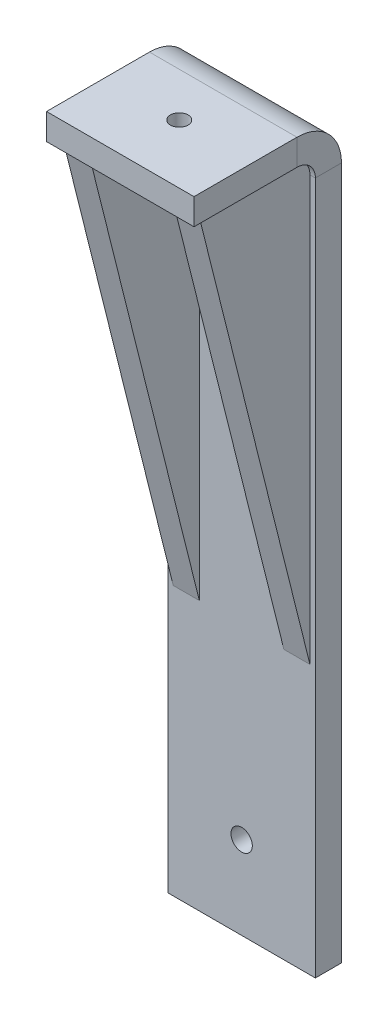
ISO-10303-21;
HEADER;
FILE_DESCRIPTION(('STEP AP214'),'2;1');
FILE_NAME('part.step','',(''),(''),'','','');
FILE_SCHEMA(('AUTOMOTIVE_DESIGN { 1 0 10303 214 1 1 1 1 }'));
ENDSEC;
DATA;
#1=APPLICATION_CONTEXT('core data for automotive mechanical design processes');
#2=APPLICATION_PROTOCOL_DEFINITION('international standard','automotive_design',2000,#1);
#3=PRODUCT_CONTEXT('',#1,'mechanical');
#4=PRODUCT('Part','Part','',(#3));
#5=PRODUCT_RELATED_PRODUCT_CATEGORY('part','',(#4));
#6=PRODUCT_DEFINITION_FORMATION('','',#4);
#7=PRODUCT_DEFINITION_CONTEXT('part definition',#1,'design');
#8=PRODUCT_DEFINITION('design','',#6,#7);
#9=PRODUCT_DEFINITION_SHAPE('','',#8);
#10=(LENGTH_UNIT() NAMED_UNIT(*) SI_UNIT(.MILLI.,.METRE.));
#11=(NAMED_UNIT(*) PLANE_ANGLE_UNIT() SI_UNIT($,.RADIAN.));
#12=(NAMED_UNIT(*) SI_UNIT($,.STERADIAN.) SOLID_ANGLE_UNIT());
#13=UNCERTAINTY_MEASURE_WITH_UNIT(LENGTH_MEASURE(1.E-05),#10,'distance_accuracy_value','');
#14=(GEOMETRIC_REPRESENTATION_CONTEXT(3) GLOBAL_UNCERTAINTY_ASSIGNED_CONTEXT((#13)) GLOBAL_UNIT_ASSIGNED_CONTEXT((#10,
#11,#12)) REPRESENTATION_CONTEXT('',''));
#15=CARTESIAN_POINT('',(0.,0.,0.));
#16=DIRECTION('',(0.,0.,1.));
#17=DIRECTION('',(1.,0.,0.));
#18=AXIS2_PLACEMENT_3D('',#15,#16,#17);
#19=CARTESIAN_POINT('',(-11.7729,122.5042,23.5458));
#20=DIRECTION('',(0.,-1.,0.));
#21=DIRECTION('',(0.,0.,-1.));
#22=AXIS2_PLACEMENT_3D('',#19,#20,#21);
#23=PLANE('',#22);
#24=DIRECTION('',(0.,0.,1.));
#25=VECTOR('',#24,1.);
#26=CARTESIAN_POINT('',(-7.2771,122.5042,23.5458));
#27=LINE('',#26,#25);
#28=CARTESIAN_POINT('',(-7.2771,122.5042,7.67079999999999));
#29=VERTEX_POINT('',#28);
#30=CARTESIAN_POINT('',(-7.2771,122.5042,23.5458));
#31=VERTEX_POINT('',#30);
#32=EDGE_CURVE('E137',#29,#31,#27,.T.);
#33=ORIENTED_EDGE('',*,*,#32,.F.);
#34=DIRECTION('',(1.,0.,0.));
#35=VECTOR('',#34,1.);
#36=CARTESIAN_POINT('',(-11.7729,122.5042,7.67079999999999));
#37=LINE('',#36,#35);
#38=CARTESIAN_POINT('',(-11.7729,122.5042,7.67079999999999));
#39=VERTEX_POINT('',#38);
#40=EDGE_CURVE('E136',#39,#29,#37,.T.);
#41=ORIENTED_EDGE('',*,*,#40,.F.);
#42=DIRECTION('',(0.,0.,1.));
#43=VECTOR('',#42,1.);
#44=CARTESIAN_POINT('',(-11.7729,122.5042,23.5458));
#45=LINE('',#44,#43);
#46=CARTESIAN_POINT('',(-11.7729,122.5042,23.5458));
#47=VERTEX_POINT('',#46);
#48=EDGE_CURVE('E131',#39,#47,#45,.T.);
#49=ORIENTED_EDGE('',*,*,#48,.T.);
#50=DIRECTION('',(1.,0.,0.));
#51=VECTOR('',#50,1.);
#52=CARTESIAN_POINT('',(-11.7729,122.5042,23.5458));
#53=LINE('',#52,#51);
#54=EDGE_CURVE('E14',#47,#31,#53,.T.);
#55=ORIENTED_EDGE('',*,*,#54,.T.);
#56=EDGE_LOOP('',(#33,#41,#49,#55));
#57=FACE_BOUND('',#56,.T.);
#58=ADVANCED_FACE('F74',(#57),#23,.F.);
#59=CARTESIAN_POINT('',(-11.7729,122.5042,23.5458));
#60=DIRECTION('',(0.,0.242535625036333,-0.970142500145332));
#61=DIRECTION('',(0.,0.970142500145332,0.242535625036333));
#62=AXIS2_PLACEMENT_3D('',#59,#60,#61);
#63=PLANE('',#62);
#64=DIRECTION('',(0.,-0.970142500145332,-0.242535625036333));
#65=VECTOR('',#64,1.);
#66=CARTESIAN_POINT('',(-7.2771,122.5042,23.5458));
#67=LINE('',#66,#65);
#68=CARTESIAN_POINT('',(-7.2771,46.3042,4.4958));
#69=VERTEX_POINT('',#68);
#70=EDGE_CURVE('E139',#31,#69,#67,.T.);
#71=ORIENTED_EDGE('',*,*,#70,.F.);
#72=ORIENTED_EDGE('',*,*,#54,.F.);
#73=DIRECTION('',(0.,-0.970142500145332,-0.242535625036333));
#74=VECTOR('',#73,1.);
#75=CARTESIAN_POINT('',(-11.7729,122.5042,23.5458));
#76=LINE('',#75,#74);
#77=CARTESIAN_POINT('',(-11.7729,46.3042,4.4958));
#78=VERTEX_POINT('',#77);
#79=EDGE_CURVE('E115',#47,#78,#76,.T.);
#80=ORIENTED_EDGE('',*,*,#79,.T.);
#81=DIRECTION('',(1.,0.,0.));
#82=VECTOR('',#81,1.);
#83=CARTESIAN_POINT('',(-11.7729,46.3042,4.4958));
#84=LINE('',#83,#82);
#85=EDGE_CURVE('E82',#78,#69,#84,.T.);
#86=ORIENTED_EDGE('',*,*,#85,.T.);
#87=EDGE_LOOP('',(#71,#72,#80,#86));
#88=FACE_BOUND('',#87,.T.);
#89=ADVANCED_FACE('F129',(#88),#63,.F.);
#90=CARTESIAN_POINT('',(-11.7729,119.3292,4.49580000000001));
#91=DIRECTION('',(0.,0.,1.));
#92=DIRECTION('',(0.,-1.,0.));
#93=AXIS2_PLACEMENT_3D('',#90,#91,#92);
#94=PLANE('',#93);
#95=DIRECTION('',(0.,1.,0.));
#96=VECTOR('',#95,1.);
#97=CARTESIAN_POINT('',(-7.2771,119.3292,4.49580000000001));
#98=LINE('',#97,#96);
#99=CARTESIAN_POINT('',(-7.2771,119.3292,4.49580000000001));
#100=VERTEX_POINT('',#99);
#101=EDGE_CURVE('E125',#69,#100,#98,.T.);
#102=ORIENTED_EDGE('',*,*,#101,.F.);
#103=ORIENTED_EDGE('',*,*,#85,.F.);
#104=DIRECTION('',(0.,1.,0.));
#105=VECTOR('',#104,1.);
#106=CARTESIAN_POINT('',(-11.7729,119.3292,4.49580000000001));
#107=LINE('',#106,#105);
#108=CARTESIAN_POINT('',(-11.7729,119.3292,4.49580000000001));
#109=VERTEX_POINT('',#108);
#110=EDGE_CURVE('E118',#78,#109,#107,.T.);
#111=ORIENTED_EDGE('',*,*,#110,.T.);
#112=DIRECTION('',(1.,0.,0.));
#113=VECTOR('',#112,1.);
#114=CARTESIAN_POINT('',(-11.7729,119.3292,4.49580000000001));
#115=LINE('',#114,#113);
#116=EDGE_CURVE('E128',#109,#100,#115,.T.);
#117=ORIENTED_EDGE('',*,*,#116,.T.);
#118=EDGE_LOOP('',(#102,#103,#111,#117));
#119=FACE_BOUND('',#118,.T.);
#120=ADVANCED_FACE('F124',(#119),#94,.F.);
#121=CARTESIAN_POINT('',(-11.7729,119.3292,7.6708));
#122=DIRECTION('',(1.,0.,0.));
#123=DIRECTION('',(0.,0.,1.));
#124=AXIS2_PLACEMENT_3D('',#121,#122,#123);
#125=CYLINDRICAL_SURFACE('',#124,3.175);
#126=CARTESIAN_POINT('',(-7.2771,119.3292,7.6708));
#127=DIRECTION('',(1.,0.,0.));
#128=DIRECTION('',(0.,0.,-1.));
#129=AXIS2_PLACEMENT_3D('',#126,#127,#128);
#130=CIRCLE('',#129,3.175);
#131=EDGE_CURVE('E104',#100,#29,#130,.T.);
#132=ORIENTED_EDGE('',*,*,#131,.F.);
#133=ORIENTED_EDGE('',*,*,#116,.F.);
#134=CARTESIAN_POINT('',(-11.7729,119.3292,7.6708));
#135=DIRECTION('',(1.,0.,0.));
#136=DIRECTION('',(0.,0.,-1.));
#137=AXIS2_PLACEMENT_3D('',#134,#135,#136);
#138=CIRCLE('',#137,3.175);
#139=EDGE_CURVE('E90',#109,#39,#138,.T.);
#140=ORIENTED_EDGE('',*,*,#139,.T.);
#141=ORIENTED_EDGE('',*,*,#40,.T.);
#142=EDGE_LOOP('',(#132,#133,#140,#141));
#143=FACE_BOUND('',#142,.T.);
#144=ADVANCED_FACE('F148',(#143),#125,.T.);
#145=CARTESIAN_POINT('',(-11.7729,119.3292,7.6708));
#146=DIRECTION('',(-1.,0.,0.));
#147=DIRECTION('',(0.,0.,-1.));
#148=AXIS2_PLACEMENT_3D('',#145,#146,#147);
#149=PLANE('',#148);
#150=ORIENTED_EDGE('',*,*,#48,.F.);
#151=ORIENTED_EDGE('',*,*,#139,.F.);
#152=ORIENTED_EDGE('',*,*,#110,.F.);
#153=ORIENTED_EDGE('',*,*,#79,.F.);
#154=EDGE_LOOP('',(#150,#151,#152,#153));
#155=FACE_BOUND('',#154,.T.);
#156=ADVANCED_FACE('F120',(#155),#149,.T.);
#157=CARTESIAN_POINT('',(-7.2771,119.3292,7.6708));
#158=DIRECTION('',(-1.,0.,0.));
#159=DIRECTION('',(0.,0.,-1.));
#160=AXIS2_PLACEMENT_3D('',#157,#158,#159);
#161=PLANE('',#160);
#162=ORIENTED_EDGE('',*,*,#32,.T.);
#163=ORIENTED_EDGE('',*,*,#70,.T.);
#164=ORIENTED_EDGE('',*,*,#101,.T.);
#165=ORIENTED_EDGE('',*,*,#131,.T.);
#166=EDGE_LOOP('',(#162,#163,#164,#165));
#167=FACE_BOUND('',#166,.T.);
#168=ADVANCED_FACE('F144',(#167),#161,.F.);
#169=CLOSED_SHELL('',(#58,#89,#120,#144,#156,#168));
#170=MANIFOLD_SOLID_BREP('B2',#169);
#171=CARTESIAN_POINT('',(11.7729,122.5042,23.5458));
#172=DIRECTION('',(0.,-1.,0.));
#173=DIRECTION('',(0.,0.,-1.));
#174=AXIS2_PLACEMENT_3D('',#171,#172,#173);
#175=PLANE('',#174);
#176=DIRECTION('',(0.,0.,1.));
#177=VECTOR('',#176,1.);
#178=CARTESIAN_POINT('',(7.2771,122.5042,23.5458));
#179=LINE('',#178,#177);
#180=CARTESIAN_POINT('',(7.2771,122.5042,7.67079999999999));
#181=VERTEX_POINT('',#180);
#182=CARTESIAN_POINT('',(7.2771,122.5042,23.5458));
#183=VERTEX_POINT('',#182);
#184=EDGE_CURVE('E270',#181,#183,#179,.T.);
#185=ORIENTED_EDGE('',*,*,#184,.T.);
#186=DIRECTION('',(-1.,0.,0.));
#187=VECTOR('',#186,1.);
#188=CARTESIAN_POINT('',(11.7729,122.5042,23.5458));
#189=LINE('',#188,#187);
#190=CARTESIAN_POINT('',(11.7729,122.5042,23.5458));
#191=VERTEX_POINT('',#190);
#192=EDGE_CURVE('E72',#191,#183,#189,.T.);
#193=ORIENTED_EDGE('',*,*,#192,.F.);
#194=DIRECTION('',(0.,0.,1.));
#195=VECTOR('',#194,1.);
#196=CARTESIAN_POINT('',(11.7729,122.5042,23.5458));
#197=LINE('',#196,#195);
#198=CARTESIAN_POINT('',(11.7729,122.5042,7.67079999999999));
#199=VERTEX_POINT('',#198);
#200=EDGE_CURVE('E258',#199,#191,#197,.T.);
#201=ORIENTED_EDGE('',*,*,#200,.F.);
#202=DIRECTION('',(-1.,0.,0.));
#203=VECTOR('',#202,1.);
#204=CARTESIAN_POINT('',(11.7729,122.5042,7.67079999999999));
#205=LINE('',#204,#203);
#206=EDGE_CURVE('E266',#199,#181,#205,.T.);
#207=ORIENTED_EDGE('',*,*,#206,.T.);
#208=EDGE_LOOP('',(#185,#193,#201,#207));
#209=FACE_BOUND('',#208,.T.);
#210=ADVANCED_FACE('F207',(#209),#175,.F.);
#211=CARTESIAN_POINT('',(11.7729,122.5042,23.5458));
#212=DIRECTION('',(0.,0.242535625036333,-0.970142500145332));
#213=DIRECTION('',(0.,0.970142500145332,0.242535625036333));
#214=AXIS2_PLACEMENT_3D('',#211,#212,#213);
#215=PLANE('',#214);
#216=DIRECTION('',(0.,-0.970142500145332,-0.242535625036333));
#217=VECTOR('',#216,1.);
#218=CARTESIAN_POINT('',(7.2771,122.5042,23.5458));
#219=LINE('',#218,#217);
#220=CARTESIAN_POINT('',(7.2771,46.3042,4.4958));
#221=VERTEX_POINT('',#220);
#222=EDGE_CURVE('E262',#183,#221,#219,.T.);
#223=ORIENTED_EDGE('',*,*,#222,.T.);
#224=DIRECTION('',(-1.,0.,0.));
#225=VECTOR('',#224,1.);
#226=CARTESIAN_POINT('',(11.7729,46.3042,4.4958));
#227=LINE('',#226,#225);
#228=CARTESIAN_POINT('',(11.7729,46.3042,4.4958));
#229=VERTEX_POINT('',#228);
#230=EDGE_CURVE('E215',#229,#221,#227,.T.);
#231=ORIENTED_EDGE('',*,*,#230,.F.);
#232=DIRECTION('',(0.,-0.970142500145332,-0.242535625036333));
#233=VECTOR('',#232,1.);
#234=CARTESIAN_POINT('',(11.7729,122.5042,23.5458));
#235=LINE('',#234,#233);
#236=EDGE_CURVE('E253',#191,#229,#235,.T.);
#237=ORIENTED_EDGE('',*,*,#236,.F.);
#238=ORIENTED_EDGE('',*,*,#192,.T.);
#239=EDGE_LOOP('',(#223,#231,#237,#238));
#240=FACE_BOUND('',#239,.T.);
#241=ADVANCED_FACE('F261',(#240),#215,.F.);
#242=CARTESIAN_POINT('',(11.7729,119.3292,4.49580000000001));
#243=DIRECTION('',(0.,0.,1.));
#244=DIRECTION('',(0.,-1.,0.));
#245=AXIS2_PLACEMENT_3D('',#242,#243,#244);
#246=PLANE('',#245);
#247=DIRECTION('',(0.,1.,0.));
#248=VECTOR('',#247,1.);
#249=CARTESIAN_POINT('',(7.2771,119.3292,4.49580000000001));
#250=LINE('',#249,#248);
#251=CARTESIAN_POINT('',(7.2771,119.3292,4.49580000000001));
#252=VERTEX_POINT('',#251);
#253=EDGE_CURVE('E240',#221,#252,#250,.T.);
#254=ORIENTED_EDGE('',*,*,#253,.T.);
#255=DIRECTION('',(-1.,0.,0.));
#256=VECTOR('',#255,1.);
#257=CARTESIAN_POINT('',(11.7729,119.3292,4.49580000000001));
#258=LINE('',#257,#256);
#259=CARTESIAN_POINT('',(11.7729,119.3292,4.49580000000001));
#260=VERTEX_POINT('',#259);
#261=EDGE_CURVE('E263',#260,#252,#258,.T.);
#262=ORIENTED_EDGE('',*,*,#261,.F.);
#263=DIRECTION('',(0.,1.,0.));
#264=VECTOR('',#263,1.);
#265=CARTESIAN_POINT('',(11.7729,119.3292,4.49580000000001));
#266=LINE('',#265,#264);
#267=EDGE_CURVE('E256',#229,#260,#266,.T.);
#268=ORIENTED_EDGE('',*,*,#267,.F.);
#269=ORIENTED_EDGE('',*,*,#230,.T.);
#270=EDGE_LOOP('',(#254,#262,#268,#269));
#271=FACE_BOUND('',#270,.T.);
#272=ADVANCED_FACE('F264',(#271),#246,.F.);
#273=CARTESIAN_POINT('',(11.7729,119.3292,7.6708));
#274=DIRECTION('',(-1.,0.,0.));
#275=DIRECTION('',(0.,0.,1.));
#276=AXIS2_PLACEMENT_3D('',#273,#274,#275);
#277=CYLINDRICAL_SURFACE('',#276,3.175);
#278=CARTESIAN_POINT('',(7.2771,119.3292,7.6708));
#279=DIRECTION('',(1.,0.,0.));
#280=DIRECTION('',(0.,0.,-1.));
#281=AXIS2_PLACEMENT_3D('',#278,#279,#280);
#282=CIRCLE('',#281,3.175);
#283=EDGE_CURVE('E246',#252,#181,#282,.T.);
#284=ORIENTED_EDGE('',*,*,#283,.T.);
#285=ORIENTED_EDGE('',*,*,#206,.F.);
#286=CARTESIAN_POINT('',(11.7729,119.3292,7.6708));
#287=DIRECTION('',(1.,0.,0.));
#288=DIRECTION('',(0.,0.,-1.));
#289=AXIS2_PLACEMENT_3D('',#286,#287,#288);
#290=CIRCLE('',#289,3.175);
#291=EDGE_CURVE('E223',#260,#199,#290,.T.);
#292=ORIENTED_EDGE('',*,*,#291,.F.);
#293=ORIENTED_EDGE('',*,*,#261,.T.);
#294=EDGE_LOOP('',(#284,#285,#292,#293));
#295=FACE_BOUND('',#294,.T.);
#296=ADVANCED_FACE('F277',(#295),#277,.T.);
#297=CARTESIAN_POINT('',(11.7729,119.3292,7.6708));
#298=DIRECTION('',(1.,0.,0.));
#299=DIRECTION('',(0.,0.,-1.));
#300=AXIS2_PLACEMENT_3D('',#297,#298,#299);
#301=PLANE('',#300);
#302=ORIENTED_EDGE('',*,*,#200,.T.);
#303=ORIENTED_EDGE('',*,*,#236,.T.);
#304=ORIENTED_EDGE('',*,*,#267,.T.);
#305=ORIENTED_EDGE('',*,*,#291,.T.);
#306=EDGE_LOOP('',(#302,#303,#304,#305));
#307=FACE_BOUND('',#306,.T.);
#308=ADVANCED_FACE('F254',(#307),#301,.T.);
#309=CARTESIAN_POINT('',(7.2771,119.3292,7.6708));
#310=DIRECTION('',(1.,0.,0.));
#311=DIRECTION('',(0.,0.,-1.));
#312=AXIS2_PLACEMENT_3D('',#309,#310,#311);
#313=PLANE('',#312);
#314=ORIENTED_EDGE('',*,*,#184,.F.);
#315=ORIENTED_EDGE('',*,*,#283,.F.);
#316=ORIENTED_EDGE('',*,*,#253,.F.);
#317=ORIENTED_EDGE('',*,*,#222,.F.);
#318=EDGE_LOOP('',(#314,#315,#316,#317));
#319=FACE_BOUND('',#318,.T.);
#320=ADVANCED_FACE('F280',(#319),#313,.F.);
#321=CLOSED_SHELL('',(#210,#241,#272,#296,#308,#320));
#322=MANIFOLD_SOLID_BREP('B8',#321);
#323=CARTESIAN_POINT('',(-12.7,127.,4.4958));
#324=DIRECTION('',(0.,0.,-1.));
#325=DIRECTION('',(-1.,0.,0.));
#326=AXIS2_PLACEMENT_3D('',#323,#324,#325);
#327=PLANE('',#326);
#328=CARTESIAN_POINT('',(0.,14.280866767059,4.4958));
#329=DIRECTION('',(0.,0.,1.));
#330=DIRECTION('',(1.,0.,0.));
#331=AXIS2_PLACEMENT_3D('',#328,#329,#330);
#332=CIRCLE('',#331,1.8415);
#333=CARTESIAN_POINT('',(1.8415,14.280866767059,4.4958));
#334=VERTEX_POINT('',#333);
#335=EDGE_CURVE('E530',#334,#334,#332,.T.);
#336=ORIENTED_EDGE('',*,*,#335,.F.);
#337=EDGE_LOOP('',(#336));
#338=FACE_BOUND('',#337,.T.);
#339=DIRECTION('',(-1.,0.,0.));
#340=VECTOR('',#339,1.);
#341=CARTESIAN_POINT('',(-12.7,119.3292,4.49580000000001));
#342=LINE('',#341,#340);
#343=CARTESIAN_POINT('',(-12.7,119.3292,4.49580000000001));
#344=VERTEX_POINT('',#343);
#345=CARTESIAN_POINT('',(12.7,119.3292,4.49580000000001));
#346=VERTEX_POINT('',#345);
#347=EDGE_CURVE('E470',#344,#346,#342,.F.);
#348=ORIENTED_EDGE('',*,*,#347,.F.);
#349=DIRECTION('',(0.,-1.,0.));
#350=VECTOR('',#349,1.);
#351=CARTESIAN_POINT('',(-12.7,127.,4.4958));
#352=LINE('',#351,#350);
#353=CARTESIAN_POINT('',(-12.7,0.,4.4958));
#354=VERTEX_POINT('',#353);
#355=EDGE_CURVE('E346',#344,#354,#352,.T.);
#356=ORIENTED_EDGE('',*,*,#355,.T.);
#357=DIRECTION('',(1.,0.,0.));
#358=VECTOR('',#357,1.);
#359=CARTESIAN_POINT('',(-12.7,0.,4.4958));
#360=LINE('',#359,#358);
#361=CARTESIAN_POINT('',(12.7,0.,4.49579999999999));
#362=VERTEX_POINT('',#361);
#363=EDGE_CURVE('E481',#354,#362,#360,.T.);
#364=ORIENTED_EDGE('',*,*,#363,.T.);
#365=DIRECTION('',(0.,-1.,0.));
#366=VECTOR('',#365,1.);
#367=CARTESIAN_POINT('',(12.7,127.,4.49579999999999));
#368=LINE('',#367,#366);
#369=EDGE_CURVE('E205',#346,#362,#368,.T.);
#370=ORIENTED_EDGE('',*,*,#369,.F.);
#371=EDGE_LOOP('',(#348,#356,#364,#370));
#372=FACE_BOUND('',#371,.T.);
#373=ADVANCED_FACE('F331',(#338,#372),#327,.F.);
#374=CARTESIAN_POINT('',(-12.7,127.,0.));
#375=DIRECTION('',(0.,0.,-1.));
#376=DIRECTION('',(-1.,0.,0.));
#377=AXIS2_PLACEMENT_3D('',#374,#375,#376);
#378=PLANE('',#377);
#379=CARTESIAN_POINT('',(0.,14.280866767059,0.));
#380=DIRECTION('',(0.,0.,1.));
#381=DIRECTION('',(1.,0.,0.));
#382=AXIS2_PLACEMENT_3D('',#379,#380,#381);
#383=CIRCLE('',#382,1.8415);
#384=CARTESIAN_POINT('',(1.8415,14.280866767059,0.));
#385=VERTEX_POINT('',#384);
#386=EDGE_CURVE('E533',#385,#385,#383,.T.);
#387=ORIENTED_EDGE('',*,*,#386,.T.);
#388=EDGE_LOOP('',(#387));
#389=FACE_BOUND('',#388,.T.);
#390=DIRECTION('',(0.,-1.,0.));
#391=VECTOR('',#390,1.);
#392=CARTESIAN_POINT('',(-12.7,127.,0.));
#393=LINE('',#392,#391);
#394=CARTESIAN_POINT('',(-12.7,119.3292,0.));
#395=VERTEX_POINT('',#394);
#396=CARTESIAN_POINT('',(-12.7,0.,0.));
#397=VERTEX_POINT('',#396);
#398=EDGE_CURVE('E354',#395,#397,#393,.T.);
#399=ORIENTED_EDGE('',*,*,#398,.F.);
#400=DIRECTION('',(-1.,0.,0.));
#401=VECTOR('',#400,1.);
#402=CARTESIAN_POINT('',(-12.7,119.3292,0.));
#403=LINE('',#402,#401);
#404=CARTESIAN_POINT('',(12.7,119.3292,0.));
#405=VERTEX_POINT('',#404);
#406=EDGE_CURVE('E453',#395,#405,#403,.F.);
#407=ORIENTED_EDGE('',*,*,#406,.T.);
#408=DIRECTION('',(0.,-1.,0.));
#409=VECTOR('',#408,1.);
#410=CARTESIAN_POINT('',(12.7,127.,0.));
#411=LINE('',#410,#409);
#412=CARTESIAN_POINT('',(12.7,0.,0.));
#413=VERTEX_POINT('',#412);
#414=EDGE_CURVE('E339',#405,#413,#411,.T.);
#415=ORIENTED_EDGE('',*,*,#414,.T.);
#416=DIRECTION('',(1.,0.,0.));
#417=VECTOR('',#416,1.);
#418=CARTESIAN_POINT('',(-12.7,0.,0.));
#419=LINE('',#418,#417);
#420=EDGE_CURVE('E490',#397,#413,#419,.T.);
#421=ORIENTED_EDGE('',*,*,#420,.F.);
#422=EDGE_LOOP('',(#399,#407,#415,#421));
#423=FACE_BOUND('',#422,.T.);
#424=ADVANCED_FACE('F505',(#389,#423),#378,.T.);
#425=CARTESIAN_POINT('',(-12.7,127.,4.4958));
#426=DIRECTION('',(-1.,0.,0.));
#427=DIRECTION('',(0.,0.,1.));
#428=AXIS2_PLACEMENT_3D('',#425,#426,#427);
#429=PLANE('',#428);
#430=ORIENTED_EDGE('',*,*,#355,.F.);
#431=DIRECTION('',(0.,0.,-1.));
#432=VECTOR('',#431,1.);
#433=CARTESIAN_POINT('',(-12.7,119.3292,4.49580000000001));
#434=LINE('',#433,#432);
#435=EDGE_CURVE('E462',#344,#395,#434,.T.);
#436=ORIENTED_EDGE('',*,*,#435,.T.);
#437=ORIENTED_EDGE('',*,*,#398,.T.);
#438=DIRECTION('',(0.,0.,-1.));
#439=VECTOR('',#438,1.);
#440=CARTESIAN_POINT('',(-12.7,0.,4.4958));
#441=LINE('',#440,#439);
#442=EDGE_CURVE('E494',#354,#397,#441,.T.);
#443=ORIENTED_EDGE('',*,*,#442,.F.);
#444=EDGE_LOOP('',(#430,#436,#437,#443));
#445=FACE_BOUND('',#444,.T.);
#446=ADVANCED_FACE('F512',(#445),#429,.T.);
#447=CARTESIAN_POINT('',(12.7,127.,0.));
#448=DIRECTION('',(1.,0.,0.));
#449=DIRECTION('',(0.,0.,-1.));
#450=AXIS2_PLACEMENT_3D('',#447,#448,#449);
#451=PLANE('',#450);
#452=DIRECTION('',(0.,0.,-1.));
#453=VECTOR('',#452,1.);
#454=CARTESIAN_POINT('',(12.7,119.3292,4.49580000000001));
#455=LINE('',#454,#453);
#456=EDGE_CURVE('E477',#346,#405,#455,.T.);
#457=ORIENTED_EDGE('',*,*,#456,.F.);
#458=ORIENTED_EDGE('',*,*,#369,.T.);
#459=DIRECTION('',(0.,0.,1.));
#460=VECTOR('',#459,1.);
#461=CARTESIAN_POINT('',(12.7,0.,0.));
#462=LINE('',#461,#460);
#463=EDGE_CURVE('E486',#413,#362,#462,.T.);
#464=ORIENTED_EDGE('',*,*,#463,.F.);
#465=ORIENTED_EDGE('',*,*,#414,.F.);
#466=EDGE_LOOP('',(#457,#458,#464,#465));
#467=FACE_BOUND('',#466,.T.);
#468=ADVANCED_FACE('F508',(#467),#451,.T.);
#469=CARTESIAN_POINT('',(0.,0.,0.));
#470=DIRECTION('',(0.,-1.,0.));
#471=DIRECTION('',(-1.,0.,0.));
#472=AXIS2_PLACEMENT_3D('',#469,#470,#471);
#473=PLANE('',#472);
#474=ORIENTED_EDGE('',*,*,#363,.F.);
#475=ORIENTED_EDGE('',*,*,#442,.T.);
#476=ORIENTED_EDGE('',*,*,#420,.T.);
#477=ORIENTED_EDGE('',*,*,#463,.T.);
#478=EDGE_LOOP('',(#474,#475,#476,#477));
#479=FACE_BOUND('',#478,.T.);
#480=ADVANCED_FACE('F511',(#479),#473,.T.);
#481=CARTESIAN_POINT('',(12.7,119.3292,7.6708));
#482=DIRECTION('',(1.,0.,0.));
#483=DIRECTION('',(0.,0.,-1.));
#484=AXIS2_PLACEMENT_3D('',#481,#482,#483);
#485=PLANE('',#484);
#486=DIRECTION('',(0.,-1.,0.));
#487=VECTOR('',#486,1.);
#488=CARTESIAN_POINT('',(12.7,127.,7.67079999999997));
#489=LINE('',#488,#487);
#490=CARTESIAN_POINT('',(12.7,122.5042,7.67079999999999));
#491=VERTEX_POINT('',#490);
#492=CARTESIAN_POINT('',(12.7,127.,7.67079999999997));
#493=VERTEX_POINT('',#492);
#494=EDGE_CURVE('E425',#491,#493,#489,.F.);
#495=ORIENTED_EDGE('',*,*,#494,.F.);
#496=CARTESIAN_POINT('',(12.7,119.3292,7.6708));
#497=DIRECTION('',(-1.,0.,0.));
#498=DIRECTION('',(0.,0.,1.));
#499=AXIS2_PLACEMENT_3D('',#496,#497,#498);
#500=CIRCLE('',#499,3.175);
#501=EDGE_CURVE('E466',#346,#491,#500,.F.);
#502=ORIENTED_EDGE('',*,*,#501,.F.);
#503=ORIENTED_EDGE('',*,*,#456,.T.);
#504=CARTESIAN_POINT('',(12.7,119.3292,7.6708));
#505=DIRECTION('',(-1.,0.,0.));
#506=DIRECTION('',(0.,0.,1.));
#507=AXIS2_PLACEMENT_3D('',#504,#505,#506);
#508=CIRCLE('',#507,7.6708);
#509=EDGE_CURVE('E457',#405,#493,#508,.F.);
#510=ORIENTED_EDGE('',*,*,#509,.T.);
#511=EDGE_LOOP('',(#495,#502,#503,#510));
#512=FACE_BOUND('',#511,.T.);
#513=ADVANCED_FACE('F574',(#512),#485,.T.);
#514=CARTESIAN_POINT('',(-12.7,119.3292,7.6708));
#515=DIRECTION('',(1.,0.,0.));
#516=DIRECTION('',(0.,0.,-1.));
#517=AXIS2_PLACEMENT_3D('',#514,#515,#516);
#518=PLANE('',#517);
#519=CARTESIAN_POINT('',(-12.7,119.3292,7.6708));
#520=DIRECTION('',(-1.,0.,0.));
#521=DIRECTION('',(0.,0.,1.));
#522=AXIS2_PLACEMENT_3D('',#519,#520,#521);
#523=CIRCLE('',#522,3.175);
#524=CARTESIAN_POINT('',(-12.7,122.5042,7.67079999999999));
#525=VERTEX_POINT('',#524);
#526=EDGE_CURVE('E473',#525,#344,#523,.T.);
#527=ORIENTED_EDGE('',*,*,#526,.F.);
#528=DIRECTION('',(0.,-1.,0.));
#529=VECTOR('',#528,1.);
#530=CARTESIAN_POINT('',(-12.7,122.5042,7.67079999999999));
#531=LINE('',#530,#529);
#532=CARTESIAN_POINT('',(-12.7,127.,7.67079999999997));
#533=VERTEX_POINT('',#532);
#534=EDGE_CURVE('E443',#525,#533,#531,.F.);
#535=ORIENTED_EDGE('',*,*,#534,.T.);
#536=CARTESIAN_POINT('',(-12.7,119.3292,7.6708));
#537=DIRECTION('',(-1.,0.,0.));
#538=DIRECTION('',(0.,0.,1.));
#539=AXIS2_PLACEMENT_3D('',#536,#537,#538);
#540=CIRCLE('',#539,7.6708);
#541=EDGE_CURVE('E458',#533,#395,#540,.T.);
#542=ORIENTED_EDGE('',*,*,#541,.T.);
#543=ORIENTED_EDGE('',*,*,#435,.F.);
#544=EDGE_LOOP('',(#527,#535,#542,#543));
#545=FACE_BOUND('',#544,.T.);
#546=ADVANCED_FACE('F515',(#545),#518,.F.);
#547=CARTESIAN_POINT('',(-12.7,119.3292,7.6708));
#548=DIRECTION('',(-1.,0.,0.));
#549=DIRECTION('',(0.,1.,0.));
#550=AXIS2_PLACEMENT_3D('',#547,#548,#549);
#551=CYLINDRICAL_SURFACE('',#550,7.6708);
#552=ORIENTED_EDGE('',*,*,#406,.F.);
#553=ORIENTED_EDGE('',*,*,#541,.F.);
#554=DIRECTION('',(-1.,0.,0.));
#555=VECTOR('',#554,1.);
#556=CARTESIAN_POINT('',(12.7,127.,7.67079999999997));
#557=LINE('',#556,#555);
#558=EDGE_CURVE('E440',#533,#493,#557,.F.);
#559=ORIENTED_EDGE('',*,*,#558,.T.);
#560=ORIENTED_EDGE('',*,*,#509,.F.);
#561=EDGE_LOOP('',(#552,#553,#559,#560));
#562=FACE_BOUND('',#561,.T.);
#563=ADVANCED_FACE('F568',(#562),#551,.T.);
#564=CARTESIAN_POINT('',(-12.7,119.3292,7.6708));
#565=DIRECTION('',(-1.,0.,0.));
#566=DIRECTION('',(0.,1.,0.));
#567=AXIS2_PLACEMENT_3D('',#564,#565,#566);
#568=CYLINDRICAL_SURFACE('',#567,3.175);
#569=ORIENTED_EDGE('',*,*,#347,.T.);
#570=ORIENTED_EDGE('',*,*,#501,.T.);
#571=DIRECTION('',(-1.,0.,0.));
#572=VECTOR('',#571,1.);
#573=CARTESIAN_POINT('',(12.7,122.5042,7.67079999999999));
#574=LINE('',#573,#572);
#575=EDGE_CURVE('E447',#491,#525,#574,.T.);
#576=ORIENTED_EDGE('',*,*,#575,.T.);
#577=ORIENTED_EDGE('',*,*,#526,.T.);
#578=EDGE_LOOP('',(#569,#570,#576,#577));
#579=FACE_BOUND('',#578,.T.);
#580=ADVANCED_FACE('F518',(#579),#568,.F.);
#581=CARTESIAN_POINT('',(-12.7,127.,25.4));
#582=DIRECTION('',(1.,0.,0.));
#583=DIRECTION('',(0.,0.,-1.));
#584=AXIS2_PLACEMENT_3D('',#581,#582,#583);
#585=PLANE('',#584);
#586=ORIENTED_EDGE('',*,*,#534,.F.);
#587=DIRECTION('',(0.,0.,-1.));
#588=VECTOR('',#587,1.);
#589=CARTESIAN_POINT('',(-12.7,122.5042,25.4));
#590=LINE('',#589,#588);
#591=CARTESIAN_POINT('',(-12.7,122.5042,25.4));
#592=VERTEX_POINT('',#591);
#593=EDGE_CURVE('E437',#525,#592,#590,.F.);
#594=ORIENTED_EDGE('',*,*,#593,.T.);
#595=DIRECTION('',(0.,-1.,0.));
#596=VECTOR('',#595,1.);
#597=CARTESIAN_POINT('',(-12.7,127.,25.4));
#598=LINE('',#597,#596);
#599=CARTESIAN_POINT('',(-12.7,127.,25.4));
#600=VERTEX_POINT('',#599);
#601=EDGE_CURVE('E421',#600,#592,#598,.T.);
#602=ORIENTED_EDGE('',*,*,#601,.F.);
#603=DIRECTION('',(0.,0.,1.));
#604=VECTOR('',#603,1.);
#605=CARTESIAN_POINT('',(-12.7,127.,-5.19462385470797E-13));
#606=LINE('',#605,#604);
#607=EDGE_CURVE('E406',#533,#600,#606,.T.);
#608=ORIENTED_EDGE('',*,*,#607,.F.);
#609=EDGE_LOOP('',(#586,#594,#602,#608));
#610=FACE_BOUND('',#609,.T.);
#611=ADVANCED_FACE('F547',(#610),#585,.F.);
#612=CARTESIAN_POINT('',(12.7,127.,4.49579999999998));
#613=DIRECTION('',(-1.,0.,0.));
#614=DIRECTION('',(0.,0.,1.));
#615=AXIS2_PLACEMENT_3D('',#612,#613,#614);
#616=PLANE('',#615);
#617=ORIENTED_EDGE('',*,*,#494,.T.);
#618=DIRECTION('',(0.,0.,-1.));
#619=VECTOR('',#618,1.);
#620=CARTESIAN_POINT('',(12.7,127.,-5.23677995375966E-13));
#621=LINE('',#620,#619);
#622=CARTESIAN_POINT('',(12.7,127.,25.4));
#623=VERTEX_POINT('',#622);
#624=EDGE_CURVE('E404',#623,#493,#621,.T.);
#625=ORIENTED_EDGE('',*,*,#624,.F.);
#626=DIRECTION('',(0.,-1.,0.));
#627=VECTOR('',#626,1.);
#628=CARTESIAN_POINT('',(12.7,127.,25.4));
#629=LINE('',#628,#627);
#630=CARTESIAN_POINT('',(12.7,122.5042,25.4));
#631=VERTEX_POINT('',#630);
#632=EDGE_CURVE('E413',#623,#631,#629,.T.);
#633=ORIENTED_EDGE('',*,*,#632,.T.);
#634=DIRECTION('',(0.,0.,1.));
#635=VECTOR('',#634,1.);
#636=CARTESIAN_POINT('',(12.7,122.5042,4.4958));
#637=LINE('',#636,#635);
#638=EDGE_CURVE('E432',#631,#491,#637,.F.);
#639=ORIENTED_EDGE('',*,*,#638,.T.);
#640=EDGE_LOOP('',(#617,#625,#633,#639));
#641=FACE_BOUND('',#640,.T.);
#642=ADVANCED_FACE('F424',(#641),#616,.F.);
#643=CARTESIAN_POINT('',(0.,127.,-5.21570190423381E-13));
#644=DIRECTION('',(0.,-1.,0.));
#645=DIRECTION('',(0.,0.,-1.));
#646=AXIS2_PLACEMENT_3D('',#643,#644,#645);
#647=PLANE('',#646);
#648=CARTESIAN_POINT('',(0.,127.,15.24));
#649=DIRECTION('',(0.,1.,0.));
#650=DIRECTION('',(0.,0.,1.));
#651=AXIS2_PLACEMENT_3D('',#648,#649,#650);
#652=CIRCLE('',#651,1.524);
#653=CARTESIAN_POINT('',(0.,127.,16.764));
#654=VERTEX_POINT('',#653);
#655=EDGE_CURVE('E452',#654,#654,#652,.T.);
#656=ORIENTED_EDGE('',*,*,#655,.F.);
#657=EDGE_LOOP('',(#656));
#658=FACE_BOUND('',#657,.T.);
#659=ORIENTED_EDGE('',*,*,#558,.F.);
#660=ORIENTED_EDGE('',*,*,#607,.T.);
#661=DIRECTION('',(1.,0.,0.));
#662=VECTOR('',#661,1.);
#663=CARTESIAN_POINT('',(0.,127.,25.4));
#664=LINE('',#663,#662);
#665=EDGE_CURVE('E399',#600,#623,#664,.T.);
#666=ORIENTED_EDGE('',*,*,#665,.T.);
#667=ORIENTED_EDGE('',*,*,#624,.T.);
#668=EDGE_LOOP('',(#659,#660,#666,#667));
#669=FACE_BOUND('',#668,.T.);
#670=ADVANCED_FACE('F402',(#658,#669),#647,.F.);
#671=CARTESIAN_POINT('',(0.,122.5042,-5.05873188620211E-13));
#672=DIRECTION('',(0.,-1.,0.));
#673=DIRECTION('',(0.,0.,-1.));
#674=AXIS2_PLACEMENT_3D('',#671,#672,#673);
#675=PLANE('',#674);
#676=CARTESIAN_POINT('',(0.,122.5042,15.24));
#677=DIRECTION('',(0.,-1.,0.));
#678=DIRECTION('',(0.,0.,-1.));
#679=AXIS2_PLACEMENT_3D('',#676,#677,#678);
#680=CIRCLE('',#679,1.524);
#681=CARTESIAN_POINT('',(0.,122.5042,13.716));
#682=VERTEX_POINT('',#681);
#683=EDGE_CURVE('E537',#682,#682,#680,.F.);
#684=ORIENTED_EDGE('',*,*,#683,.T.);
#685=EDGE_LOOP('',(#684));
#686=FACE_BOUND('',#685,.T.);
#687=ORIENTED_EDGE('',*,*,#593,.F.);
#688=ORIENTED_EDGE('',*,*,#575,.F.);
#689=ORIENTED_EDGE('',*,*,#638,.F.);
#690=DIRECTION('',(-1.,0.,0.));
#691=VECTOR('',#690,1.);
#692=CARTESIAN_POINT('',(12.7,122.5042,25.4));
#693=LINE('',#692,#691);
#694=EDGE_CURVE('E416',#592,#631,#693,.F.);
#695=ORIENTED_EDGE('',*,*,#694,.F.);
#696=EDGE_LOOP('',(#687,#688,#689,#695));
#697=FACE_BOUND('',#696,.T.);
#698=ADVANCED_FACE('F550',(#686,#697),#675,.T.);
#699=CARTESIAN_POINT('',(12.7,127.,25.4));
#700=DIRECTION('',(0.,0.,-1.));
#701=DIRECTION('',(0.,1.,0.));
#702=AXIS2_PLACEMENT_3D('',#699,#700,#701);
#703=PLANE('',#702);
#704=ORIENTED_EDGE('',*,*,#694,.T.);
#705=ORIENTED_EDGE('',*,*,#632,.F.);
#706=ORIENTED_EDGE('',*,*,#665,.F.);
#707=ORIENTED_EDGE('',*,*,#601,.T.);
#708=EDGE_LOOP('',(#704,#705,#706,#707));
#709=FACE_BOUND('',#708,.T.);
#710=ADVANCED_FACE('F414',(#709),#703,.F.);
#711=CARTESIAN_POINT('',(0.,-0.00100000000002876,15.2400000000004));
#712=DIRECTION('',(0.,1.,0.));
#713=DIRECTION('',(0.,0.,1.));
#714=AXIS2_PLACEMENT_3D('',#711,#712,#713);
#715=CYLINDRICAL_SURFACE('',#714,1.524);
#716=ORIENTED_EDGE('',*,*,#683,.F.);
#717=EDGE_LOOP('',(#716));
#718=FACE_BOUND('',#717,.T.);
#719=ORIENTED_EDGE('',*,*,#655,.T.);
#720=EDGE_LOOP('',(#719));
#721=FACE_BOUND('',#720,.T.);
#722=ADVANCED_FACE('F558',(#718,#721),#715,.F.);
#723=CARTESIAN_POINT('',(0.,14.280866767059,0.));
#724=DIRECTION('',(0.,0.,1.));
#725=DIRECTION('',(1.,0.,0.));
#726=AXIS2_PLACEMENT_3D('',#723,#724,#725);
#727=CYLINDRICAL_SURFACE('',#726,1.8415);
#728=ORIENTED_EDGE('',*,*,#386,.F.);
#729=EDGE_LOOP('',(#728));
#730=FACE_BOUND('',#729,.T.);
#731=ORIENTED_EDGE('',*,*,#335,.T.);
#732=EDGE_LOOP('',(#731));
#733=FACE_BOUND('',#732,.T.);
#734=ADVANCED_FACE('F637',(#730,#733),#727,.F.);
#735=CLOSED_SHELL('',(#373,#424,#446,#468,#480,#513,#546,#563,#580,#611,#642,#670,#698,#710,
#722,#734));
#736=MANIFOLD_SOLID_BREP('B66',#735);
#737=ADVANCED_BREP_SHAPE_REPRESENTATION('',(#18,#170,#322,#736),#14);
#738=SHAPE_DEFINITION_REPRESENTATION(#9,#737);
ENDSEC;
END-ISO-10303-21;
